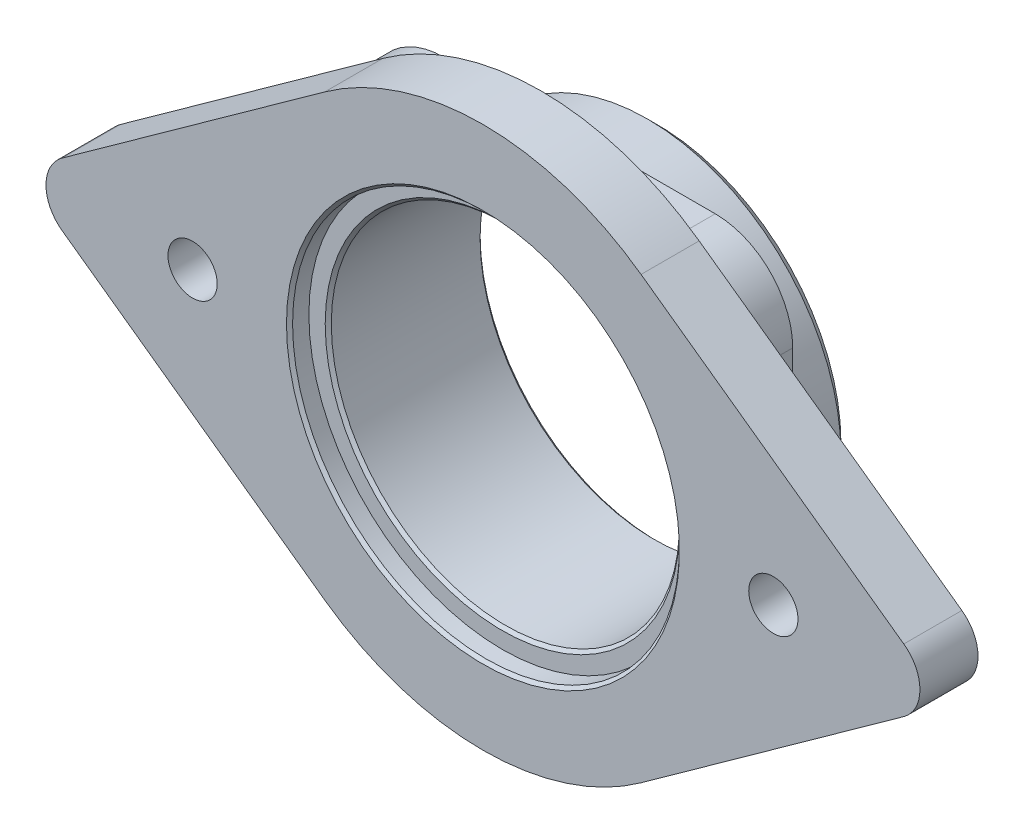
ISO-10303-21;
HEADER;
FILE_DESCRIPTION(('STEP AP214'),'2;1');
FILE_NAME('part.step','',(''),(''),'','','');
FILE_SCHEMA(('AUTOMOTIVE_DESIGN { 1 0 10303 214 1 1 1 1 }'));
ENDSEC;
DATA;
#1=APPLICATION_CONTEXT('core data for automotive mechanical design processes');
#2=APPLICATION_PROTOCOL_DEFINITION('international standard','automotive_design',2000,#1);
#3=PRODUCT_CONTEXT('',#1,'mechanical');
#4=PRODUCT('Part','Part','',(#3));
#5=PRODUCT_RELATED_PRODUCT_CATEGORY('part','',(#4));
#6=PRODUCT_DEFINITION_FORMATION('','',#4);
#7=PRODUCT_DEFINITION_CONTEXT('part definition',#1,'design');
#8=PRODUCT_DEFINITION('design','',#6,#7);
#9=PRODUCT_DEFINITION_SHAPE('','',#8);
#10=(LENGTH_UNIT() NAMED_UNIT(*) SI_UNIT(.MILLI.,.METRE.));
#11=(NAMED_UNIT(*) PLANE_ANGLE_UNIT() SI_UNIT($,.RADIAN.));
#12=(NAMED_UNIT(*) SI_UNIT($,.STERADIAN.) SOLID_ANGLE_UNIT());
#13=UNCERTAINTY_MEASURE_WITH_UNIT(LENGTH_MEASURE(1.E-05),#10,'distance_accuracy_value','');
#14=(GEOMETRIC_REPRESENTATION_CONTEXT(3) GLOBAL_UNCERTAINTY_ASSIGNED_CONTEXT((#13)) GLOBAL_UNIT_ASSIGNED_CONTEXT((#10,
#11,#12)) REPRESENTATION_CONTEXT('',''));
#15=CARTESIAN_POINT('',(0.,0.,0.));
#16=DIRECTION('',(0.,0.,1.));
#17=DIRECTION('',(1.,0.,0.));
#18=AXIS2_PLACEMENT_3D('',#15,#16,#17);
#19=CARTESIAN_POINT('',(32.6571428571429,0.,-2.38125));
#20=DIRECTION('',(0.,0.,-1.));
#21=DIRECTION('',(-1.,0.,0.));
#22=AXIS2_PLACEMENT_3D('',#19,#20,#21);
#23=PLANE('',#22);
#24=CARTESIAN_POINT('',(-23.8125,0.,-2.38125));
#25=DIRECTION('',(0.,0.,-1.));
#26=DIRECTION('',(-1.,0.,0.));
#27=AXIS2_PLACEMENT_3D('',#24,#25,#26);
#28=CIRCLE('',#27,2.01929999999997);
#29=CARTESIAN_POINT('',(-25.8318,0.,-2.38125));
#30=VERTEX_POINT('',#29);
#31=EDGE_CURVE('E441',#30,#30,#28,.T.);
#32=ORIENTED_EDGE('',*,*,#31,.F.);
#33=EDGE_LOOP('',(#32));
#34=FACE_BOUND('',#33,.T.);
#35=CARTESIAN_POINT('',(23.8125,0.,-2.38125));
#36=DIRECTION('',(0.,0.,-1.));
#37=DIRECTION('',(-1.,0.,0.));
#38=AXIS2_PLACEMENT_3D('',#35,#36,#37);
#39=CIRCLE('',#38,2.01929999999997);
#40=CARTESIAN_POINT('',(21.7932,0.,-2.38125));
#41=VERTEX_POINT('',#40);
#42=EDGE_CURVE('E348',#41,#41,#39,.T.);
#43=ORIENTED_EDGE('',*,*,#42,.F.);
#44=EDGE_LOOP('',(#43));
#45=FACE_BOUND('',#44,.T.);
#46=DIRECTION('',(-0.812232862067414,-0.583333333333334,0.));
#47=VECTOR('',#46,1.);
#48=CARTESIAN_POINT('',(34.5092261904762,-2.57883933706403,-2.38125));
#49=LINE('',#48,#47);
#50=CARTESIAN_POINT('',(34.5092261904762,-2.57883933706403,-2.38125));
#51=VERTEX_POINT('',#50);
#52=CARTESIAN_POINT('',(12.9645833333333,-18.0518753594483,-2.38125));
#53=VERTEX_POINT('',#52);
#54=EDGE_CURVE('E175',#51,#53,#49,.T.);
#55=ORIENTED_EDGE('',*,*,#54,.T.);
#56=CARTESIAN_POINT('',(0.,0.,-2.38125));
#57=DIRECTION('',(0.,0.,-1.));
#58=DIRECTION('',(-1.,0.,0.));
#59=AXIS2_PLACEMENT_3D('',#56,#57,#58);
#60=CIRCLE('',#59,22.225);
#61=CARTESIAN_POINT('',(-12.9645833333333,-18.0518753594483,-2.38125));
#62=VERTEX_POINT('',#61);
#63=EDGE_CURVE('E247',#53,#62,#60,.T.);
#64=ORIENTED_EDGE('',*,*,#63,.T.);
#65=DIRECTION('',(-0.812232862067414,0.583333333333333,0.));
#66=VECTOR('',#65,1.);
#67=CARTESIAN_POINT('',(0.,-27.3628426501111,-2.38125));
#68=LINE('',#67,#66);
#69=CARTESIAN_POINT('',(-34.5092261904762,-2.57883933706404,-2.38125));
#70=VERTEX_POINT('',#69);
#71=EDGE_CURVE('E200',#62,#70,#68,.T.);
#72=ORIENTED_EDGE('',*,*,#71,.T.);
#73=CARTESIAN_POINT('',(-32.6571428571429,0.,-2.38125));
#74=DIRECTION('',(0.,0.,-1.));
#75=DIRECTION('',(-1.,0.,0.));
#76=AXIS2_PLACEMENT_3D('',#73,#74,#75);
#77=CIRCLE('',#76,3.175);
#78=CARTESIAN_POINT('',(-34.5092261904762,2.57883933706403,-2.38125));
#79=VERTEX_POINT('',#78);
#80=EDGE_CURVE('E202',#70,#79,#77,.T.);
#81=ORIENTED_EDGE('',*,*,#80,.T.);
#82=DIRECTION('',(0.812232862067414,0.583333333333333,0.));
#83=VECTOR('',#82,1.);
#84=CARTESIAN_POINT('',(-34.5092261904762,2.57883933706403,-2.38125));
#85=LINE('',#84,#83);
#86=CARTESIAN_POINT('',(-12.9645833333333,18.0518753594483,-2.38125));
#87=VERTEX_POINT('',#86);
#88=EDGE_CURVE('E205',#79,#87,#85,.T.);
#89=ORIENTED_EDGE('',*,*,#88,.T.);
#90=CARTESIAN_POINT('',(0.,0.,-2.38125));
#91=DIRECTION('',(0.,0.,-1.));
#92=DIRECTION('',(-1.,0.,0.));
#93=AXIS2_PLACEMENT_3D('',#90,#91,#92);
#94=CIRCLE('',#93,22.225);
#95=CARTESIAN_POINT('',(12.9645833333334,18.0518753594483,-2.38125));
#96=VERTEX_POINT('',#95);
#97=EDGE_CURVE('E245',#87,#96,#94,.T.);
#98=ORIENTED_EDGE('',*,*,#97,.T.);
#99=DIRECTION('',(0.812232862067413,-0.583333333333334,0.));
#100=VECTOR('',#99,1.);
#101=CARTESIAN_POINT('',(0.,27.3628426501111,-2.38125));
#102=LINE('',#101,#100);
#103=CARTESIAN_POINT('',(34.5092261904762,2.57883933706405,-2.38125));
#104=VERTEX_POINT('',#103);
#105=EDGE_CURVE('E185',#96,#104,#102,.T.);
#106=ORIENTED_EDGE('',*,*,#105,.T.);
#107=CARTESIAN_POINT('',(32.6571428571429,0.,-2.38125));
#108=DIRECTION('',(0.,0.,-1.));
#109=DIRECTION('',(-1.,0.,0.));
#110=AXIS2_PLACEMENT_3D('',#107,#108,#109);
#111=CIRCLE('',#110,3.175);
#112=EDGE_CURVE('E172',#104,#51,#111,.T.);
#113=ORIENTED_EDGE('',*,*,#112,.T.);
#114=EDGE_LOOP('',(#55,#64,#72,#81,#89,#98,#106,#113));
#115=FACE_BOUND('',#114,.T.);
#116=DIRECTION('',(-1.,0.,0.));
#117=VECTOR('',#116,1.);
#118=CARTESIAN_POINT('',(-11.1125,-17.4625,-2.38125));
#119=LINE('',#118,#117);
#120=CARTESIAN_POINT('',(11.1125,-17.4625,-2.38125));
#121=VERTEX_POINT('',#120);
#122=CARTESIAN_POINT('',(-11.1125,-17.4625,-2.38125));
#123=VERTEX_POINT('',#122);
#124=EDGE_CURVE('E345',#121,#123,#119,.T.);
#125=ORIENTED_EDGE('',*,*,#124,.F.);
#126=CARTESIAN_POINT('',(11.1125,-11.1125,-2.38125));
#127=DIRECTION('',(0.,0.,-1.));
#128=DIRECTION('',(1.,0.,0.));
#129=AXIS2_PLACEMENT_3D('',#126,#127,#128);
#130=CIRCLE('',#129,6.35);
#131=CARTESIAN_POINT('',(17.4625,-11.1125,-2.38125));
#132=VERTEX_POINT('',#131);
#133=EDGE_CURVE('E170',#132,#121,#130,.T.);
#134=ORIENTED_EDGE('',*,*,#133,.F.);
#135=DIRECTION('',(0.,-1.,0.));
#136=VECTOR('',#135,1.);
#137=CARTESIAN_POINT('',(17.4625,-11.1125,-2.38125));
#138=LINE('',#137,#136);
#139=CARTESIAN_POINT('',(17.4625,11.1125,-2.38125));
#140=VERTEX_POINT('',#139);
#141=EDGE_CURVE('E166',#140,#132,#138,.T.);
#142=ORIENTED_EDGE('',*,*,#141,.F.);
#143=CARTESIAN_POINT('',(11.1125,11.1125,-2.38125));
#144=DIRECTION('',(0.,0.,-1.));
#145=DIRECTION('',(1.,0.,0.));
#146=AXIS2_PLACEMENT_3D('',#143,#144,#145);
#147=CIRCLE('',#146,6.35);
#148=CARTESIAN_POINT('',(11.1125,17.4625,-2.38125));
#149=VERTEX_POINT('',#148);
#150=EDGE_CURVE('E372',#149,#140,#147,.T.);
#151=ORIENTED_EDGE('',*,*,#150,.F.);
#152=DIRECTION('',(1.,0.,0.));
#153=VECTOR('',#152,1.);
#154=CARTESIAN_POINT('',(11.1125,17.4625,-2.38125));
#155=LINE('',#154,#153);
#156=CARTESIAN_POINT('',(-11.1125,17.4625,-2.38125));
#157=VERTEX_POINT('',#156);
#158=EDGE_CURVE('E370',#157,#149,#155,.T.);
#159=ORIENTED_EDGE('',*,*,#158,.F.);
#160=CARTESIAN_POINT('',(-11.1125,11.1125,-2.38125));
#161=DIRECTION('',(0.,0.,-1.));
#162=DIRECTION('',(1.,0.,0.));
#163=AXIS2_PLACEMENT_3D('',#160,#161,#162);
#164=CIRCLE('',#163,6.35);
#165=CARTESIAN_POINT('',(-17.4625,11.1125,-2.38125));
#166=VERTEX_POINT('',#165);
#167=EDGE_CURVE('E368',#166,#157,#164,.T.);
#168=ORIENTED_EDGE('',*,*,#167,.F.);
#169=DIRECTION('',(0.,1.,0.));
#170=VECTOR('',#169,1.);
#171=CARTESIAN_POINT('',(-17.4625,11.1125,-2.38125));
#172=LINE('',#171,#170);
#173=CARTESIAN_POINT('',(-17.4625,-11.1125,-2.38125));
#174=VERTEX_POINT('',#173);
#175=EDGE_CURVE('E366',#174,#166,#172,.T.);
#176=ORIENTED_EDGE('',*,*,#175,.F.);
#177=CARTESIAN_POINT('',(-11.1125,-11.1125,-2.38125));
#178=DIRECTION('',(0.,0.,-1.));
#179=DIRECTION('',(1.,0.,0.));
#180=AXIS2_PLACEMENT_3D('',#177,#178,#179);
#181=CIRCLE('',#180,6.35);
#182=EDGE_CURVE('E364',#123,#174,#181,.T.);
#183=ORIENTED_EDGE('',*,*,#182,.F.);
#184=EDGE_LOOP('',(#125,#134,#142,#151,#159,#168,#176,#183));
#185=FACE_BOUND('',#184,.T.);
#186=ADVANCED_FACE('F34',(#34,#45,#115,#185),#23,.T.);
#187=CARTESIAN_POINT('',(32.6571428571429,0.,2.38125));
#188=DIRECTION('',(0.,0.,-1.));
#189=DIRECTION('',(-1.,0.,0.));
#190=AXIS2_PLACEMENT_3D('',#187,#188,#189);
#191=CYLINDRICAL_SURFACE('',#190,3.175);
#192=ORIENTED_EDGE('',*,*,#112,.F.);
#193=DIRECTION('',(0.,0.,-1.));
#194=VECTOR('',#193,1.);
#195=CARTESIAN_POINT('',(34.5092261904762,2.57883933706405,2.38125));
#196=LINE('',#195,#194);
#197=CARTESIAN_POINT('',(34.5092261904762,2.57883933706405,2.38125));
#198=VERTEX_POINT('',#197);
#199=EDGE_CURVE('E209',#198,#104,#196,.T.);
#200=ORIENTED_EDGE('',*,*,#199,.F.);
#201=CARTESIAN_POINT('',(32.6571428571429,0.,2.38125));
#202=DIRECTION('',(0.,0.,-1.));
#203=DIRECTION('',(-1.,0.,0.));
#204=AXIS2_PLACEMENT_3D('',#201,#202,#203);
#205=CIRCLE('',#204,3.175);
#206=CARTESIAN_POINT('',(34.5092261904762,-2.57883933706403,2.38125));
#207=VERTEX_POINT('',#206);
#208=EDGE_CURVE('E181',#198,#207,#205,.T.);
#209=ORIENTED_EDGE('',*,*,#208,.T.);
#210=DIRECTION('',(0.,0.,-1.));
#211=VECTOR('',#210,1.);
#212=CARTESIAN_POINT('',(34.5092261904762,-2.57883933706403,2.38125));
#213=LINE('',#212,#211);
#214=EDGE_CURVE('E196',#207,#51,#213,.T.);
#215=ORIENTED_EDGE('',*,*,#214,.T.);
#216=EDGE_LOOP('',(#192,#200,#209,#215));
#217=FACE_BOUND('',#216,.T.);
#218=ADVANCED_FACE('F282',(#217),#191,.T.);
#219=CARTESIAN_POINT('',(0.,27.3628426501111,2.38125));
#220=DIRECTION('',(0.583333333333334,0.812232862067413,0.));
#221=DIRECTION('',(-0.812232862067413,0.583333333333334,0.));
#222=AXIS2_PLACEMENT_3D('',#219,#220,#221);
#223=PLANE('',#222);
#224=ORIENTED_EDGE('',*,*,#105,.F.);
#225=DIRECTION('',(0.,0.,-1.));
#226=VECTOR('',#225,1.);
#227=CARTESIAN_POINT('',(12.9645833333334,18.0518753594483,2.38125));
#228=LINE('',#227,#226);
#229=CARTESIAN_POINT('',(12.9645833333334,18.0518753594483,2.38125));
#230=VERTEX_POINT('',#229);
#231=EDGE_CURVE('E11',#96,#230,#228,.F.);
#232=ORIENTED_EDGE('',*,*,#231,.T.);
#233=DIRECTION('',(0.812232862067413,-0.583333333333334,0.));
#234=VECTOR('',#233,1.);
#235=CARTESIAN_POINT('',(0.,27.3628426501111,2.38125));
#236=LINE('',#235,#234);
#237=EDGE_CURVE('E195',#230,#198,#236,.T.);
#238=ORIENTED_EDGE('',*,*,#237,.T.);
#239=ORIENTED_EDGE('',*,*,#199,.T.);
#240=EDGE_LOOP('',(#224,#232,#238,#239));
#241=FACE_BOUND('',#240,.T.);
#242=ADVANCED_FACE('F295',(#241),#223,.T.);
#243=CARTESIAN_POINT('',(-34.5092261904762,2.57883933706403,2.38125));
#244=DIRECTION('',(-0.583333333333333,0.812232862067414,0.));
#245=DIRECTION('',(-0.812232862067414,-0.583333333333333,0.));
#246=AXIS2_PLACEMENT_3D('',#243,#244,#245);
#247=PLANE('',#246);
#248=DIRECTION('',(0.812232862067414,0.583333333333333,0.));
#249=VECTOR('',#248,1.);
#250=CARTESIAN_POINT('',(-34.5092261904762,2.57883933706403,2.38125));
#251=LINE('',#250,#249);
#252=CARTESIAN_POINT('',(-34.5092261904762,2.57883933706403,2.38125));
#253=VERTEX_POINT('',#252);
#254=CARTESIAN_POINT('',(-12.9645833333333,18.0518753594483,2.38125));
#255=VERTEX_POINT('',#254);
#256=EDGE_CURVE('E193',#253,#255,#251,.T.);
#257=ORIENTED_EDGE('',*,*,#256,.T.);
#258=DIRECTION('',(0.,0.,-1.));
#259=VECTOR('',#258,1.);
#260=CARTESIAN_POINT('',(-12.9645833333333,18.0518753594483,2.38125));
#261=LINE('',#260,#259);
#262=EDGE_CURVE('E42',#255,#87,#261,.T.);
#263=ORIENTED_EDGE('',*,*,#262,.T.);
#264=ORIENTED_EDGE('',*,*,#88,.F.);
#265=DIRECTION('',(0.,0.,-1.));
#266=VECTOR('',#265,1.);
#267=CARTESIAN_POINT('',(-34.5092261904762,2.57883933706403,2.38125));
#268=LINE('',#267,#266);
#269=EDGE_CURVE('E213',#253,#79,#268,.T.);
#270=ORIENTED_EDGE('',*,*,#269,.F.);
#271=EDGE_LOOP('',(#257,#263,#264,#270));
#272=FACE_BOUND('',#271,.T.);
#273=ADVANCED_FACE('F257',(#272),#247,.T.);
#274=CARTESIAN_POINT('',(-32.6571428571429,0.,2.38125));
#275=DIRECTION('',(0.,0.,-1.));
#276=DIRECTION('',(-1.,0.,0.));
#277=AXIS2_PLACEMENT_3D('',#274,#275,#276);
#278=CYLINDRICAL_SURFACE('',#277,3.175);
#279=ORIENTED_EDGE('',*,*,#80,.F.);
#280=DIRECTION('',(0.,0.,-1.));
#281=VECTOR('',#280,1.);
#282=CARTESIAN_POINT('',(-34.5092261904762,-2.57883933706404,2.38125));
#283=LINE('',#282,#281);
#284=CARTESIAN_POINT('',(-34.5092261904762,-2.57883933706404,2.38125));
#285=VERTEX_POINT('',#284);
#286=EDGE_CURVE('E215',#285,#70,#283,.T.);
#287=ORIENTED_EDGE('',*,*,#286,.F.);
#288=CARTESIAN_POINT('',(-32.6571428571429,0.,2.38125));
#289=DIRECTION('',(0.,0.,-1.));
#290=DIRECTION('',(-1.,0.,0.));
#291=AXIS2_PLACEMENT_3D('',#288,#289,#290);
#292=CIRCLE('',#291,3.175);
#293=EDGE_CURVE('E190',#285,#253,#292,.T.);
#294=ORIENTED_EDGE('',*,*,#293,.T.);
#295=ORIENTED_EDGE('',*,*,#269,.T.);
#296=EDGE_LOOP('',(#279,#287,#294,#295));
#297=FACE_BOUND('',#296,.T.);
#298=ADVANCED_FACE('F265',(#297),#278,.T.);
#299=CARTESIAN_POINT('',(0.,-27.3628426501111,2.38125));
#300=DIRECTION('',(-0.583333333333333,-0.812232862067414,0.));
#301=DIRECTION('',(0.812232862067414,-0.583333333333333,0.));
#302=AXIS2_PLACEMENT_3D('',#299,#300,#301);
#303=PLANE('',#302);
#304=ORIENTED_EDGE('',*,*,#71,.F.);
#305=DIRECTION('',(0.,0.,-1.));
#306=VECTOR('',#305,1.);
#307=CARTESIAN_POINT('',(-12.9645833333333,-18.0518753594483,2.38125));
#308=LINE('',#307,#306);
#309=CARTESIAN_POINT('',(-12.9645833333333,-18.0518753594483,2.38125));
#310=VERTEX_POINT('',#309);
#311=EDGE_CURVE('E249',#62,#310,#308,.F.);
#312=ORIENTED_EDGE('',*,*,#311,.T.);
#313=DIRECTION('',(-0.812232862067414,0.583333333333333,0.));
#314=VECTOR('',#313,1.);
#315=CARTESIAN_POINT('',(0.,-27.3628426501111,2.38125));
#316=LINE('',#315,#314);
#317=EDGE_CURVE('E188',#310,#285,#316,.T.);
#318=ORIENTED_EDGE('',*,*,#317,.T.);
#319=ORIENTED_EDGE('',*,*,#286,.T.);
#320=EDGE_LOOP('',(#304,#312,#318,#319));
#321=FACE_BOUND('',#320,.T.);
#322=ADVANCED_FACE('F308',(#321),#303,.T.);
#323=CARTESIAN_POINT('',(34.5092261904762,-2.57883933706403,2.38125));
#324=DIRECTION('',(0.583333333333333,-0.812232862067414,0.));
#325=DIRECTION('',(0.812232862067414,0.583333333333333,0.));
#326=AXIS2_PLACEMENT_3D('',#323,#324,#325);
#327=PLANE('',#326);
#328=DIRECTION('',(-0.812232862067414,-0.583333333333334,0.));
#329=VECTOR('',#328,1.);
#330=CARTESIAN_POINT('',(34.5092261904762,-2.57883933706403,2.38125));
#331=LINE('',#330,#329);
#332=CARTESIAN_POINT('',(12.9645833333333,-18.0518753594483,2.38125));
#333=VERTEX_POINT('',#332);
#334=EDGE_CURVE('E184',#207,#333,#331,.T.);
#335=ORIENTED_EDGE('',*,*,#334,.T.);
#336=DIRECTION('',(0.,0.,-1.));
#337=VECTOR('',#336,1.);
#338=CARTESIAN_POINT('',(12.9645833333333,-18.0518753594483,2.38125));
#339=LINE('',#338,#337);
#340=EDGE_CURVE('E242',#333,#53,#339,.T.);
#341=ORIENTED_EDGE('',*,*,#340,.T.);
#342=ORIENTED_EDGE('',*,*,#54,.F.);
#343=ORIENTED_EDGE('',*,*,#214,.F.);
#344=EDGE_LOOP('',(#335,#341,#342,#343));
#345=FACE_BOUND('',#344,.T.);
#346=ADVANCED_FACE('F278',(#345),#327,.T.);
#347=CARTESIAN_POINT('',(32.6571428571429,0.,2.38125));
#348=DIRECTION('',(0.,0.,-1.));
#349=DIRECTION('',(-1.,0.,0.));
#350=AXIS2_PLACEMENT_3D('',#347,#348,#349);
#351=PLANE('',#350);
#352=CARTESIAN_POINT('',(0.,0.,2.38125));
#353=DIRECTION('',(0.,0.,-1.));
#354=DIRECTION('',(-1.,0.,0.));
#355=AXIS2_PLACEMENT_3D('',#352,#353,#354);
#356=CIRCLE('',#355,16.1122999999999);
#357=CARTESIAN_POINT('',(-16.1122999999999,0.,2.38125));
#358=VERTEX_POINT('',#357);
#359=EDGE_CURVE('E233',#358,#358,#356,.T.);
#360=ORIENTED_EDGE('',*,*,#359,.T.);
#361=EDGE_LOOP('',(#360));
#362=FACE_BOUND('',#361,.T.);
#363=CARTESIAN_POINT('',(-23.8125,0.,2.38125));
#364=DIRECTION('',(0.,0.,-1.));
#365=DIRECTION('',(-1.,0.,0.));
#366=AXIS2_PLACEMENT_3D('',#363,#364,#365);
#367=CIRCLE('',#366,2.01929999999999);
#368=CARTESIAN_POINT('',(-25.8318,0.,2.38125));
#369=VERTEX_POINT('',#368);
#370=EDGE_CURVE('E431',#369,#369,#367,.T.);
#371=ORIENTED_EDGE('',*,*,#370,.T.);
#372=EDGE_LOOP('',(#371));
#373=FACE_BOUND('',#372,.T.);
#374=CARTESIAN_POINT('',(23.8125,0.,2.38125));
#375=DIRECTION('',(0.,0.,-1.));
#376=DIRECTION('',(-1.,0.,0.));
#377=AXIS2_PLACEMENT_3D('',#374,#375,#376);
#378=CIRCLE('',#377,2.01929999999999);
#379=CARTESIAN_POINT('',(21.7932,0.,2.38125));
#380=VERTEX_POINT('',#379);
#381=EDGE_CURVE('E343',#380,#380,#378,.T.);
#382=ORIENTED_EDGE('',*,*,#381,.T.);
#383=EDGE_LOOP('',(#382));
#384=FACE_BOUND('',#383,.T.);
#385=ORIENTED_EDGE('',*,*,#317,.F.);
#386=CARTESIAN_POINT('',(0.,0.,2.38125));
#387=DIRECTION('',(0.,0.,-1.));
#388=DIRECTION('',(-1.,0.,0.));
#389=AXIS2_PLACEMENT_3D('',#386,#387,#388);
#390=CIRCLE('',#389,22.225);
#391=EDGE_CURVE('E252',#310,#333,#390,.F.);
#392=ORIENTED_EDGE('',*,*,#391,.T.);
#393=ORIENTED_EDGE('',*,*,#334,.F.);
#394=ORIENTED_EDGE('',*,*,#208,.F.);
#395=ORIENTED_EDGE('',*,*,#237,.F.);
#396=CARTESIAN_POINT('',(0.,0.,2.38125));
#397=DIRECTION('',(0.,0.,-1.));
#398=DIRECTION('',(-1.,0.,0.));
#399=AXIS2_PLACEMENT_3D('',#396,#397,#398);
#400=CIRCLE('',#399,22.225);
#401=EDGE_CURVE('E49',#230,#255,#400,.F.);
#402=ORIENTED_EDGE('',*,*,#401,.T.);
#403=ORIENTED_EDGE('',*,*,#256,.F.);
#404=ORIENTED_EDGE('',*,*,#293,.F.);
#405=EDGE_LOOP('',(#385,#392,#393,#394,#395,#402,#403,#404));
#406=FACE_BOUND('',#405,.T.);
#407=ADVANCED_FACE('F268',(#362,#373,#384,#406),#351,.F.);
#408=CARTESIAN_POINT('',(11.1125,-11.1125,-5.55625));
#409=DIRECTION('',(0.,0.,1.));
#410=DIRECTION('',(1.,0.,0.));
#411=AXIS2_PLACEMENT_3D('',#408,#409,#410);
#412=CYLINDRICAL_SURFACE('',#411,6.35);
#413=ORIENTED_EDGE('',*,*,#133,.T.);
#414=DIRECTION('',(0.,0.,1.));
#415=VECTOR('',#414,1.);
#416=CARTESIAN_POINT('',(11.1125,-17.4625,-5.55625));
#417=LINE('',#416,#415);
#418=CARTESIAN_POINT('',(11.1125,-17.4625,-5.55625));
#419=VERTEX_POINT('',#418);
#420=EDGE_CURVE('E150',#419,#121,#417,.T.);
#421=ORIENTED_EDGE('',*,*,#420,.F.);
#422=CARTESIAN_POINT('',(11.1125,-11.1125,-5.55625));
#423=DIRECTION('',(0.,0.,-1.));
#424=DIRECTION('',(1.,0.,0.));
#425=AXIS2_PLACEMENT_3D('',#422,#423,#424);
#426=CIRCLE('',#425,6.35);
#427=CARTESIAN_POINT('',(17.4625,-11.1125,-5.55625));
#428=VERTEX_POINT('',#427);
#429=EDGE_CURVE('E157',#428,#419,#426,.T.);
#430=ORIENTED_EDGE('',*,*,#429,.F.);
#431=DIRECTION('',(0.,0.,1.));
#432=VECTOR('',#431,1.);
#433=CARTESIAN_POINT('',(17.4625,-11.1125,-5.55625));
#434=LINE('',#433,#432);
#435=EDGE_CURVE('E361',#428,#132,#434,.T.);
#436=ORIENTED_EDGE('',*,*,#435,.T.);
#437=EDGE_LOOP('',(#413,#421,#430,#436));
#438=FACE_BOUND('',#437,.T.);
#439=ADVANCED_FACE('F168',(#438),#412,.T.);
#440=CARTESIAN_POINT('',(-11.1125,-17.4625,-5.55625));
#441=DIRECTION('',(0.,1.,0.));
#442=DIRECTION('',(0.,0.,1.));
#443=AXIS2_PLACEMENT_3D('',#440,#441,#442);
#444=PLANE('',#443);
#445=ORIENTED_EDGE('',*,*,#124,.T.);
#446=DIRECTION('',(0.,0.,1.));
#447=VECTOR('',#446,1.);
#448=CARTESIAN_POINT('',(-11.1125,-17.4625,-5.55625));
#449=LINE('',#448,#447);
#450=CARTESIAN_POINT('',(-11.1125,-17.4625,-5.55625));
#451=VERTEX_POINT('',#450);
#452=EDGE_CURVE('E153',#451,#123,#449,.T.);
#453=ORIENTED_EDGE('',*,*,#452,.F.);
#454=DIRECTION('',(-1.,0.,0.));
#455=VECTOR('',#454,1.);
#456=CARTESIAN_POINT('',(-11.1125,-17.4625,-5.55625));
#457=LINE('',#456,#455);
#458=EDGE_CURVE('E146',#419,#451,#457,.T.);
#459=ORIENTED_EDGE('',*,*,#458,.F.);
#460=ORIENTED_EDGE('',*,*,#420,.T.);
#461=EDGE_LOOP('',(#445,#453,#459,#460));
#462=FACE_BOUND('',#461,.T.);
#463=ADVANCED_FACE('F148',(#462),#444,.F.);
#464=CARTESIAN_POINT('',(-11.1125,-11.1125,-5.55625));
#465=DIRECTION('',(0.,0.,1.));
#466=DIRECTION('',(1.,0.,0.));
#467=AXIS2_PLACEMENT_3D('',#464,#465,#466);
#468=CYLINDRICAL_SURFACE('',#467,6.35);
#469=ORIENTED_EDGE('',*,*,#182,.T.);
#470=DIRECTION('',(0.,0.,1.));
#471=VECTOR('',#470,1.);
#472=CARTESIAN_POINT('',(-17.4625,-11.1125,-5.55625));
#473=LINE('',#472,#471);
#474=CARTESIAN_POINT('',(-17.4625,-11.1125,-5.55625));
#475=VERTEX_POINT('',#474);
#476=EDGE_CURVE('E177',#475,#174,#473,.T.);
#477=ORIENTED_EDGE('',*,*,#476,.F.);
#478=CARTESIAN_POINT('',(-11.1125,-11.1125,-5.55625));
#479=DIRECTION('',(0.,0.,-1.));
#480=DIRECTION('',(1.,0.,0.));
#481=AXIS2_PLACEMENT_3D('',#478,#479,#480);
#482=CIRCLE('',#481,6.35);
#483=EDGE_CURVE('E156',#451,#475,#482,.T.);
#484=ORIENTED_EDGE('',*,*,#483,.F.);
#485=ORIENTED_EDGE('',*,*,#452,.T.);
#486=EDGE_LOOP('',(#469,#477,#484,#485));
#487=FACE_BOUND('',#486,.T.);
#488=ADVANCED_FACE('F409',(#487),#468,.T.);
#489=CARTESIAN_POINT('',(-17.4625,11.1125,-5.55625));
#490=DIRECTION('',(1.,0.,0.));
#491=DIRECTION('',(0.,0.,-1.));
#492=AXIS2_PLACEMENT_3D('',#489,#490,#491);
#493=PLANE('',#492);
#494=ORIENTED_EDGE('',*,*,#175,.T.);
#495=DIRECTION('',(0.,0.,1.));
#496=VECTOR('',#495,1.);
#497=CARTESIAN_POINT('',(-17.4625,11.1125,-5.55625));
#498=LINE('',#497,#496);
#499=CARTESIAN_POINT('',(-17.4625,11.1125,-5.55625));
#500=VERTEX_POINT('',#499);
#501=EDGE_CURVE('E385',#500,#166,#498,.T.);
#502=ORIENTED_EDGE('',*,*,#501,.F.);
#503=DIRECTION('',(0.,1.,0.));
#504=VECTOR('',#503,1.);
#505=CARTESIAN_POINT('',(-17.4625,11.1125,-5.55625));
#506=LINE('',#505,#504);
#507=EDGE_CURVE('E353',#475,#500,#506,.T.);
#508=ORIENTED_EDGE('',*,*,#507,.F.);
#509=ORIENTED_EDGE('',*,*,#476,.T.);
#510=EDGE_LOOP('',(#494,#502,#508,#509));
#511=FACE_BOUND('',#510,.T.);
#512=ADVANCED_FACE('F392',(#511),#493,.F.);
#513=CARTESIAN_POINT('',(-11.1125,11.1125,-5.55625));
#514=DIRECTION('',(0.,0.,1.));
#515=DIRECTION('',(1.,0.,0.));
#516=AXIS2_PLACEMENT_3D('',#513,#514,#515);
#517=CYLINDRICAL_SURFACE('',#516,6.35);
#518=ORIENTED_EDGE('',*,*,#167,.T.);
#519=DIRECTION('',(0.,0.,1.));
#520=VECTOR('',#519,1.);
#521=CARTESIAN_POINT('',(-11.1125,17.4625,-5.55625));
#522=LINE('',#521,#520);
#523=CARTESIAN_POINT('',(-11.1125,17.4625,-5.55625));
#524=VERTEX_POINT('',#523);
#525=EDGE_CURVE('E382',#524,#157,#522,.T.);
#526=ORIENTED_EDGE('',*,*,#525,.F.);
#527=CARTESIAN_POINT('',(-11.1125,11.1125,-5.55625));
#528=DIRECTION('',(0.,0.,-1.));
#529=DIRECTION('',(1.,0.,0.));
#530=AXIS2_PLACEMENT_3D('',#527,#528,#529);
#531=CIRCLE('',#530,6.35);
#532=EDGE_CURVE('E355',#500,#524,#531,.T.);
#533=ORIENTED_EDGE('',*,*,#532,.F.);
#534=ORIENTED_EDGE('',*,*,#501,.T.);
#535=EDGE_LOOP('',(#518,#526,#533,#534));
#536=FACE_BOUND('',#535,.T.);
#537=ADVANCED_FACE('F401',(#536),#517,.T.);
#538=CARTESIAN_POINT('',(11.1125,17.4625,-5.55625));
#539=DIRECTION('',(0.,-1.,0.));
#540=DIRECTION('',(0.,0.,-1.));
#541=AXIS2_PLACEMENT_3D('',#538,#539,#540);
#542=PLANE('',#541);
#543=ORIENTED_EDGE('',*,*,#158,.T.);
#544=DIRECTION('',(0.,0.,1.));
#545=VECTOR('',#544,1.);
#546=CARTESIAN_POINT('',(11.1125,17.4625,-5.55625));
#547=LINE('',#546,#545);
#548=CARTESIAN_POINT('',(11.1125,17.4625,-5.55625));
#549=VERTEX_POINT('',#548);
#550=EDGE_CURVE('E379',#549,#149,#547,.T.);
#551=ORIENTED_EDGE('',*,*,#550,.F.);
#552=DIRECTION('',(1.,0.,0.));
#553=VECTOR('',#552,1.);
#554=CARTESIAN_POINT('',(11.1125,17.4625,-5.55625));
#555=LINE('',#554,#553);
#556=EDGE_CURVE('E357',#524,#549,#555,.T.);
#557=ORIENTED_EDGE('',*,*,#556,.F.);
#558=ORIENTED_EDGE('',*,*,#525,.T.);
#559=EDGE_LOOP('',(#543,#551,#557,#558));
#560=FACE_BOUND('',#559,.T.);
#561=ADVANCED_FACE('F405',(#560),#542,.F.);
#562=CARTESIAN_POINT('',(11.1125,11.1125,-5.55625));
#563=DIRECTION('',(0.,0.,1.));
#564=DIRECTION('',(1.,0.,0.));
#565=AXIS2_PLACEMENT_3D('',#562,#563,#564);
#566=CYLINDRICAL_SURFACE('',#565,6.35);
#567=ORIENTED_EDGE('',*,*,#150,.T.);
#568=DIRECTION('',(0.,0.,1.));
#569=VECTOR('',#568,1.);
#570=CARTESIAN_POINT('',(17.4625,11.1125,-5.55625));
#571=LINE('',#570,#569);
#572=CARTESIAN_POINT('',(17.4625,11.1125,-5.55625));
#573=VERTEX_POINT('',#572);
#574=EDGE_CURVE('E377',#573,#140,#571,.T.);
#575=ORIENTED_EDGE('',*,*,#574,.F.);
#576=CARTESIAN_POINT('',(11.1125,11.1125,-5.55625));
#577=DIRECTION('',(0.,0.,-1.));
#578=DIRECTION('',(1.,0.,0.));
#579=AXIS2_PLACEMENT_3D('',#576,#577,#578);
#580=CIRCLE('',#579,6.35);
#581=EDGE_CURVE('E359',#549,#573,#580,.T.);
#582=ORIENTED_EDGE('',*,*,#581,.F.);
#583=ORIENTED_EDGE('',*,*,#550,.T.);
#584=EDGE_LOOP('',(#567,#575,#582,#583));
#585=FACE_BOUND('',#584,.T.);
#586=ADVANCED_FACE('F476',(#585),#566,.T.);
#587=CARTESIAN_POINT('',(17.4625,-11.1125,-5.55625));
#588=DIRECTION('',(-1.,0.,0.));
#589=DIRECTION('',(0.,0.,1.));
#590=AXIS2_PLACEMENT_3D('',#587,#588,#589);
#591=PLANE('',#590);
#592=ORIENTED_EDGE('',*,*,#141,.T.);
#593=ORIENTED_EDGE('',*,*,#435,.F.);
#594=DIRECTION('',(0.,-1.,0.));
#595=VECTOR('',#594,1.);
#596=CARTESIAN_POINT('',(17.4625,-11.1125,-5.55625));
#597=LINE('',#596,#595);
#598=EDGE_CURVE('E162',#573,#428,#597,.T.);
#599=ORIENTED_EDGE('',*,*,#598,.F.);
#600=ORIENTED_EDGE('',*,*,#574,.T.);
#601=EDGE_LOOP('',(#592,#593,#599,#600));
#602=FACE_BOUND('',#601,.T.);
#603=ADVANCED_FACE('F473',(#602),#591,.F.);
#604=CARTESIAN_POINT('',(11.1125,-11.1125,-5.55625));
#605=DIRECTION('',(0.,0.,1.));
#606=DIRECTION('',(1.,0.,0.));
#607=AXIS2_PLACEMENT_3D('',#604,#605,#606);
#608=PLANE('',#607);
#609=CARTESIAN_POINT('',(0.,0.,-5.55625));
#610=DIRECTION('',(0.,0.,1.));
#611=DIRECTION('',(1.,0.,0.));
#612=AXIS2_PLACEMENT_3D('',#609,#610,#611);
#613=CIRCLE('',#612,15.8623);
#614=CARTESIAN_POINT('',(15.8623,0.,-5.55625));
#615=VERTEX_POINT('',#614);
#616=EDGE_CURVE('E341',#615,#615,#613,.T.);
#617=ORIENTED_EDGE('',*,*,#616,.T.);
#618=EDGE_LOOP('',(#617));
#619=FACE_BOUND('',#618,.T.);
#620=ORIENTED_EDGE('',*,*,#429,.T.);
#621=ORIENTED_EDGE('',*,*,#458,.T.);
#622=ORIENTED_EDGE('',*,*,#483,.T.);
#623=ORIENTED_EDGE('',*,*,#507,.T.);
#624=ORIENTED_EDGE('',*,*,#532,.T.);
#625=ORIENTED_EDGE('',*,*,#556,.T.);
#626=ORIENTED_EDGE('',*,*,#581,.T.);
#627=ORIENTED_EDGE('',*,*,#598,.T.);
#628=EDGE_LOOP('',(#620,#621,#622,#623,#624,#625,#626,#627));
#629=FACE_BOUND('',#628,.T.);
#630=ADVANCED_FACE('F160',(#619,#629),#608,.F.);
#631=CARTESIAN_POINT('',(0.,0.,-11.90625));
#632=DIRECTION('',(0.,0.,1.));
#633=DIRECTION('',(1.,0.,0.));
#634=AXIS2_PLACEMENT_3D('',#631,#632,#633);
#635=CYLINDRICAL_SURFACE('',#634,15.8623);
#636=CARTESIAN_POINT('',(0.,0.,-11.1125));
#637=DIRECTION('',(0.,0.,-1.));
#638=DIRECTION('',(-1.,0.,0.));
#639=AXIS2_PLACEMENT_3D('',#636,#637,#638);
#640=CIRCLE('',#639,15.8623);
#641=CARTESIAN_POINT('',(-15.8623,0.,-11.1125));
#642=VERTEX_POINT('',#641);
#643=EDGE_CURVE('E236',#642,#642,#640,.F.);
#644=ORIENTED_EDGE('',*,*,#643,.T.);
#645=EDGE_LOOP('',(#644));
#646=FACE_BOUND('',#645,.T.);
#647=ORIENTED_EDGE('',*,*,#616,.F.);
#648=EDGE_LOOP('',(#647));
#649=FACE_BOUND('',#648,.T.);
#650=ADVANCED_FACE('F334',(#646,#649),#635,.T.);
#651=CARTESIAN_POINT('',(15.8623,0.,-11.90625));
#652=DIRECTION('',(0.,0.,-1.));
#653=DIRECTION('',(-1.,0.,0.));
#654=AXIS2_PLACEMENT_3D('',#651,#652,#653);
#655=PLANE('',#654);
#656=CARTESIAN_POINT('',(0.,0.,-11.90625));
#657=DIRECTION('',(0.,0.,-1.));
#658=DIRECTION('',(-1.,0.,0.));
#659=AXIS2_PLACEMENT_3D('',#656,#657,#658);
#660=CIRCLE('',#659,15.06855);
#661=CARTESIAN_POINT('',(-15.06855,0.,-11.90625));
#662=VERTEX_POINT('',#661);
#663=EDGE_CURVE('E239',#662,#662,#660,.T.);
#664=ORIENTED_EDGE('',*,*,#663,.T.);
#665=EDGE_LOOP('',(#664));
#666=FACE_BOUND('',#665,.T.);
#667=CARTESIAN_POINT('',(0.,0.,-11.90625));
#668=DIRECTION('',(0.,0.,-1.));
#669=DIRECTION('',(-1.,0.,0.));
#670=AXIS2_PLACEMENT_3D('',#667,#668,#669);
#671=CIRCLE('',#670,14.5247999999999);
#672=CARTESIAN_POINT('',(-14.5247999999999,0.,-11.90625));
#673=VERTEX_POINT('',#672);
#674=EDGE_CURVE('E212',#673,#673,#671,.F.);
#675=ORIENTED_EDGE('',*,*,#674,.T.);
#676=EDGE_LOOP('',(#675));
#677=FACE_BOUND('',#676,.T.);
#678=ADVANCED_FACE('F337',(#666,#677),#655,.T.);
#679=CARTESIAN_POINT('',(23.8125,0.,-2.38125));
#680=DIRECTION('',(0.,0.,-1.));
#681=DIRECTION('',(-1.,0.,0.));
#682=AXIS2_PLACEMENT_3D('',#679,#680,#681);
#683=CYLINDRICAL_SURFACE('',#682,2.01929999999998);
#684=ORIENTED_EDGE('',*,*,#381,.F.);
#685=EDGE_LOOP('',(#684));
#686=FACE_BOUND('',#685,.T.);
#687=ORIENTED_EDGE('',*,*,#42,.T.);
#688=EDGE_LOOP('',(#687));
#689=FACE_BOUND('',#688,.T.);
#690=ADVANCED_FACE('F434',(#686,#689),#683,.F.);
#691=CARTESIAN_POINT('',(-23.8125,0.,-2.38125));
#692=DIRECTION('',(0.,0.,-1.));
#693=DIRECTION('',(-1.,0.,0.));
#694=AXIS2_PLACEMENT_3D('',#691,#692,#693);
#695=CYLINDRICAL_SURFACE('',#694,2.01929999999998);
#696=ORIENTED_EDGE('',*,*,#370,.F.);
#697=EDGE_LOOP('',(#696));
#698=FACE_BOUND('',#697,.T.);
#699=ORIENTED_EDGE('',*,*,#31,.T.);
#700=EDGE_LOOP('',(#699));
#701=FACE_BOUND('',#700,.T.);
#702=ADVANCED_FACE('F437',(#698,#701),#695,.F.);
#703=CARTESIAN_POINT('',(0.,0.,2.38125));
#704=DIRECTION('',(0.,0.,1.));
#705=DIRECTION('',(1.,0.,0.));
#706=AXIS2_PLACEMENT_3D('',#703,#704,#705);
#707=CYLINDRICAL_SURFACE('',#706,14.2748);
#708=CARTESIAN_POINT('',(0.,0.,-11.6562500000001));
#709=DIRECTION('',(0.,0.,-1.));
#710=DIRECTION('',(-1.,0.,0.));
#711=AXIS2_PLACEMENT_3D('',#708,#709,#710);
#712=CIRCLE('',#711,14.2748);
#713=CARTESIAN_POINT('',(-14.2748,0.,-11.6562500000001));
#714=VERTEX_POINT('',#713);
#715=EDGE_CURVE('E224',#714,#714,#712,.T.);
#716=ORIENTED_EDGE('',*,*,#715,.T.);
#717=EDGE_LOOP('',(#716));
#718=FACE_BOUND('',#717,.T.);
#719=CARTESIAN_POINT('',(0.,0.,0.543750000000098));
#720=DIRECTION('',(0.,0.,-1.));
#721=DIRECTION('',(-1.,0.,0.));
#722=AXIS2_PLACEMENT_3D('',#719,#720,#721);
#723=CIRCLE('',#722,14.2748);
#724=CARTESIAN_POINT('',(-14.2748,0.,0.543750000000098));
#725=VERTEX_POINT('',#724);
#726=EDGE_CURVE('E221',#725,#725,#723,.F.);
#727=ORIENTED_EDGE('',*,*,#726,.T.);
#728=EDGE_LOOP('',(#727));
#729=FACE_BOUND('',#728,.T.);
#730=ADVANCED_FACE('F458',(#718,#729),#707,.F.);
#731=CARTESIAN_POINT('',(14.2748,0.,0.793750000000002));
#732=DIRECTION('',(0.,0.,-1.));
#733=DIRECTION('',(-1.,0.,0.));
#734=AXIS2_PLACEMENT_3D('',#731,#732,#733);
#735=PLANE('',#734);
#736=CARTESIAN_POINT('',(0.,0.,0.793750000000002));
#737=DIRECTION('',(0.,0.,-1.));
#738=DIRECTION('',(-1.,0.,0.));
#739=AXIS2_PLACEMENT_3D('',#736,#737,#738);
#740=CIRCLE('',#739,14.5247999999999);
#741=CARTESIAN_POINT('',(-14.5247999999999,0.,0.793750000000002));
#742=VERTEX_POINT('',#741);
#743=EDGE_CURVE('E227',#742,#742,#740,.T.);
#744=ORIENTED_EDGE('',*,*,#743,.T.);
#745=EDGE_LOOP('',(#744));
#746=FACE_BOUND('',#745,.T.);
#747=CARTESIAN_POINT('',(0.,0.,0.793750000000002));
#748=DIRECTION('',(0.,0.,1.));
#749=DIRECTION('',(1.,0.,0.));
#750=AXIS2_PLACEMENT_3D('',#747,#748,#749);
#751=CIRCLE('',#750,15.8623);
#752=CARTESIAN_POINT('',(15.8623,0.,0.793750000000002));
#753=VERTEX_POINT('',#752);
#754=EDGE_CURVE('E446',#753,#753,#751,.T.);
#755=ORIENTED_EDGE('',*,*,#754,.T.);
#756=EDGE_LOOP('',(#755));
#757=FACE_BOUND('',#756,.T.);
#758=ADVANCED_FACE('F450',(#746,#757),#735,.F.);
#759=CARTESIAN_POINT('',(0.,0.,2.38125));
#760=DIRECTION('',(0.,0.,1.));
#761=DIRECTION('',(1.,0.,0.));
#762=AXIS2_PLACEMENT_3D('',#759,#760,#761);
#763=CYLINDRICAL_SURFACE('',#762,15.8623);
#764=CARTESIAN_POINT('',(0.,0.,2.1312500000001));
#765=DIRECTION('',(0.,0.,-1.));
#766=DIRECTION('',(-1.,0.,0.));
#767=AXIS2_PLACEMENT_3D('',#764,#765,#766);
#768=CIRCLE('',#767,15.8623);
#769=CARTESIAN_POINT('',(-15.8623,0.,2.1312500000001));
#770=VERTEX_POINT('',#769);
#771=EDGE_CURVE('E230',#770,#770,#768,.F.);
#772=ORIENTED_EDGE('',*,*,#771,.T.);
#773=EDGE_LOOP('',(#772));
#774=FACE_BOUND('',#773,.T.);
#775=ORIENTED_EDGE('',*,*,#754,.F.);
#776=EDGE_LOOP('',(#775));
#777=FACE_BOUND('',#776,.T.);
#778=ADVANCED_FACE('F317',(#774,#777),#763,.F.);
#779=CARTESIAN_POINT('',(0.,0.,-11.90625));
#780=DIRECTION('',(0.,0.,-1.));
#781=DIRECTION('',(-1.,0.,0.));
#782=AXIS2_PLACEMENT_3D('',#779,#780,#781);
#783=CONICAL_SURFACE('',#782,14.5247999999999,0.785398163397469);
#784=ORIENTED_EDGE('',*,*,#715,.F.);
#785=EDGE_LOOP('',(#784));
#786=FACE_BOUND('',#785,.T.);
#787=ORIENTED_EDGE('',*,*,#674,.F.);
#788=EDGE_LOOP('',(#787));
#789=FACE_BOUND('',#788,.T.);
#790=ADVANCED_FACE('F313',(#786,#789),#783,.F.);
#791=CARTESIAN_POINT('',(0.,0.,0.543750000000098));
#792=DIRECTION('',(0.,0.,1.));
#793=DIRECTION('',(1.,0.,0.));
#794=AXIS2_PLACEMENT_3D('',#791,#792,#793);
#795=CONICAL_SURFACE('',#794,14.2748,0.785398163397441);
#796=ORIENTED_EDGE('',*,*,#743,.F.);
#797=EDGE_LOOP('',(#796));
#798=FACE_BOUND('',#797,.T.);
#799=ORIENTED_EDGE('',*,*,#726,.F.);
#800=EDGE_LOOP('',(#799));
#801=FACE_BOUND('',#800,.T.);
#802=ADVANCED_FACE('F316',(#798,#801),#795,.F.);
#803=CARTESIAN_POINT('',(0.,0.,2.1312500000001));
#804=DIRECTION('',(0.,0.,1.));
#805=DIRECTION('',(1.,0.,0.));
#806=AXIS2_PLACEMENT_3D('',#803,#804,#805);
#807=CONICAL_SURFACE('',#806,15.8623,0.785398163397434);
#808=ORIENTED_EDGE('',*,*,#359,.F.);
#809=EDGE_LOOP('',(#808));
#810=FACE_BOUND('',#809,.T.);
#811=ORIENTED_EDGE('',*,*,#771,.F.);
#812=EDGE_LOOP('',(#811));
#813=FACE_BOUND('',#812,.T.);
#814=ADVANCED_FACE('F321',(#810,#813),#807,.F.);
#815=CARTESIAN_POINT('',(0.,0.,-11.1125));
#816=DIRECTION('',(0.,0.,1.));
#817=DIRECTION('',(1.,0.,0.));
#818=AXIS2_PLACEMENT_3D('',#815,#816,#817);
#819=CONICAL_SURFACE('',#818,15.8623,0.785398163397455);
#820=ORIENTED_EDGE('',*,*,#663,.F.);
#821=EDGE_LOOP('',(#820));
#822=FACE_BOUND('',#821,.T.);
#823=ORIENTED_EDGE('',*,*,#643,.F.);
#824=EDGE_LOOP('',(#823));
#825=FACE_BOUND('',#824,.T.);
#826=ADVANCED_FACE('F288',(#822,#825),#819,.T.);
#827=CARTESIAN_POINT('',(0.,0.,2.38125));
#828=DIRECTION('',(0.,0.,-1.));
#829=DIRECTION('',(-1.,0.,0.));
#830=AXIS2_PLACEMENT_3D('',#827,#828,#829);
#831=CYLINDRICAL_SURFACE('',#830,22.225);
#832=ORIENTED_EDGE('',*,*,#391,.F.);
#833=ORIENTED_EDGE('',*,*,#311,.F.);
#834=ORIENTED_EDGE('',*,*,#63,.F.);
#835=ORIENTED_EDGE('',*,*,#340,.F.);
#836=EDGE_LOOP('',(#832,#833,#834,#835));
#837=FACE_BOUND('',#836,.T.);
#838=ADVANCED_FACE('F275',(#837),#831,.T.);
#839=CARTESIAN_POINT('',(0.,0.,2.38125));
#840=DIRECTION('',(0.,0.,-1.));
#841=DIRECTION('',(-1.,0.,0.));
#842=AXIS2_PLACEMENT_3D('',#839,#840,#841);
#843=CYLINDRICAL_SURFACE('',#842,22.225);
#844=ORIENTED_EDGE('',*,*,#401,.F.);
#845=ORIENTED_EDGE('',*,*,#231,.F.);
#846=ORIENTED_EDGE('',*,*,#97,.F.);
#847=ORIENTED_EDGE('',*,*,#262,.F.);
#848=EDGE_LOOP('',(#844,#845,#846,#847));
#849=FACE_BOUND('',#848,.T.);
#850=ADVANCED_FACE('F36',(#849),#843,.T.);
#851=CLOSED_SHELL('',(#186,#218,#242,#273,#298,#322,#346,#407,#439,#463,#488,#512,#537,#561,
#586,#603,#630,#650,#678,#690,#702,#730,#758,#778,#790,#802,#814,#826,#838,#850));
#852=MANIFOLD_SOLID_BREP('B2',#851);
#853=ADVANCED_BREP_SHAPE_REPRESENTATION('',(#18,#852),#14);
#854=SHAPE_DEFINITION_REPRESENTATION(#9,#853);
ENDSEC;
END-ISO-10303-21;
